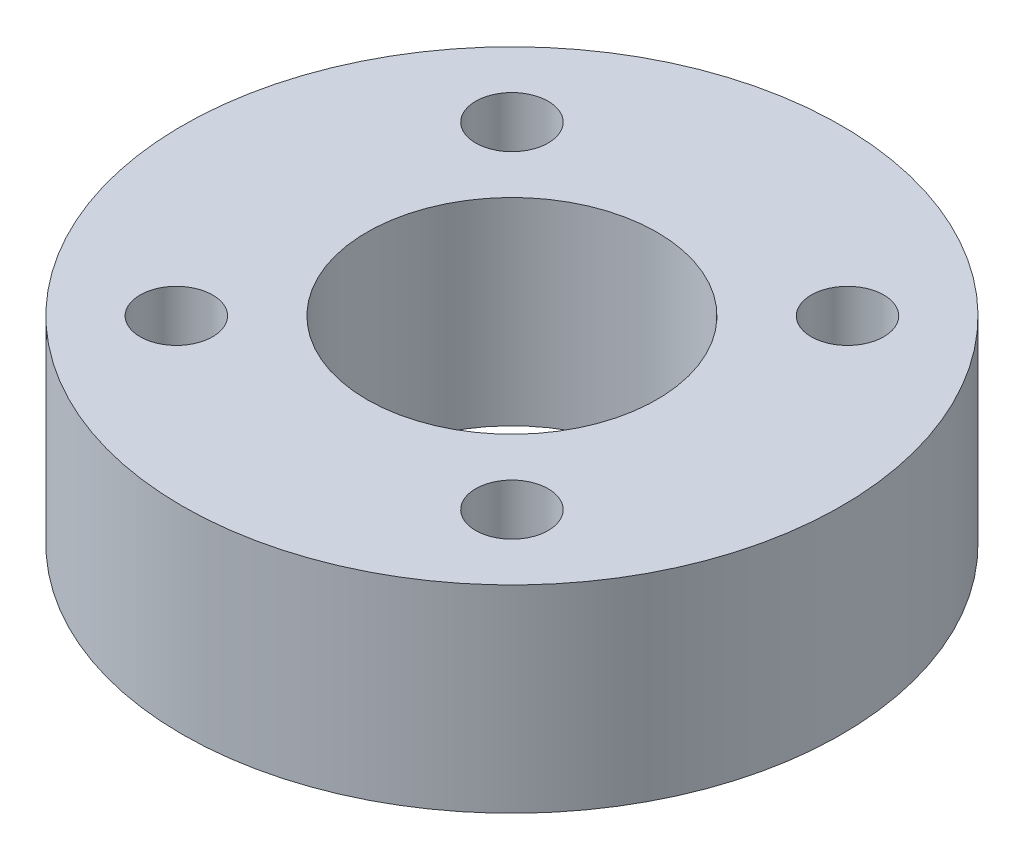
ISO-10303-21;
HEADER;
FILE_DESCRIPTION(('STEP AP214'),'2;1');
FILE_NAME('part.step','',(''),(''),'','','');
FILE_SCHEMA(('AUTOMOTIVE_DESIGN { 1 0 10303 214 1 1 1 1 }'));
ENDSEC;
DATA;
#1=APPLICATION_CONTEXT('core data for automotive mechanical design processes');
#2=APPLICATION_PROTOCOL_DEFINITION('international standard','automotive_design',2000,#1);
#3=PRODUCT_CONTEXT('',#1,'mechanical');
#4=PRODUCT('Part','Part','',(#3));
#5=PRODUCT_RELATED_PRODUCT_CATEGORY('part','',(#4));
#6=PRODUCT_DEFINITION_FORMATION('','',#4);
#7=PRODUCT_DEFINITION_CONTEXT('part definition',#1,'design');
#8=PRODUCT_DEFINITION('design','',#6,#7);
#9=PRODUCT_DEFINITION_SHAPE('','',#8);
#10=(LENGTH_UNIT() NAMED_UNIT(*) SI_UNIT(.MILLI.,.METRE.));
#11=(NAMED_UNIT(*) PLANE_ANGLE_UNIT() SI_UNIT($,.RADIAN.));
#12=(NAMED_UNIT(*) SI_UNIT($,.STERADIAN.) SOLID_ANGLE_UNIT());
#13=UNCERTAINTY_MEASURE_WITH_UNIT(LENGTH_MEASURE(1.E-05),#10,'distance_accuracy_value','');
#14=(GEOMETRIC_REPRESENTATION_CONTEXT(3) GLOBAL_UNCERTAINTY_ASSIGNED_CONTEXT((#13)) GLOBAL_UNIT_ASSIGNED_CONTEXT((#10,
#11,#12)) REPRESENTATION_CONTEXT('',''));
#15=CARTESIAN_POINT('',(0.,0.,0.));
#16=DIRECTION('',(0.,0.,1.));
#17=DIRECTION('',(1.,0.,0.));
#18=AXIS2_PLACEMENT_3D('',#15,#16,#17);
#19=CARTESIAN_POINT('',(0.,15.,0.));
#20=DIRECTION('',(0.,-1.,0.));
#21=DIRECTION('',(0.,0.,-1.));
#22=AXIS2_PLACEMENT_3D('',#19,#20,#21);
#23=CYLINDRICAL_SURFACE('',#22,25.);
#24=CARTESIAN_POINT('',(0.,15.,0.));
#25=DIRECTION('',(0.,1.,0.));
#26=DIRECTION('',(0.,0.,1.));
#27=AXIS2_PLACEMENT_3D('',#24,#25,#26);
#28=CIRCLE('',#27,25.);
#29=CARTESIAN_POINT('',(0.,15.,25.));
#30=VERTEX_POINT('',#29);
#31=EDGE_CURVE('E10',#30,#30,#28,.T.);
#32=ORIENTED_EDGE('',*,*,#31,.F.);
#33=EDGE_LOOP('',(#32));
#34=FACE_BOUND('',#33,.T.);
#35=CARTESIAN_POINT('',(0.,0.,0.));
#36=DIRECTION('',(0.,1.,0.));
#37=DIRECTION('',(0.,0.,1.));
#38=AXIS2_PLACEMENT_3D('',#35,#36,#37);
#39=CIRCLE('',#38,25.);
#40=CARTESIAN_POINT('',(0.,0.,25.));
#41=VERTEX_POINT('',#40);
#42=EDGE_CURVE('E40',#41,#41,#39,.T.);
#43=ORIENTED_EDGE('',*,*,#42,.T.);
#44=EDGE_LOOP('',(#43));
#45=FACE_BOUND('',#44,.T.);
#46=ADVANCED_FACE('F37',(#34,#45),#23,.T.);
#47=CARTESIAN_POINT('',(0.,15.,0.));
#48=DIRECTION('',(0.,1.,0.));
#49=DIRECTION('',(0.,0.,1.));
#50=AXIS2_PLACEMENT_3D('',#47,#48,#49);
#51=PLANE('',#50);
#52=CARTESIAN_POINT('',(-12.7279220613579,15.,-12.7279220613579));
#53=DIRECTION('',(0.,1.,0.));
#54=DIRECTION('',(0.,0.,1.));
#55=AXIS2_PLACEMENT_3D('',#52,#53,#54);
#56=CIRCLE('',#55,2.75);
#57=CARTESIAN_POINT('',(-12.7279220613579,15.,-9.97792206135786));
#58=VERTEX_POINT('',#57);
#59=EDGE_CURVE('E75',#58,#58,#56,.T.);
#60=ORIENTED_EDGE('',*,*,#59,.F.);
#61=EDGE_LOOP('',(#60));
#62=FACE_BOUND('',#61,.T.);
#63=CARTESIAN_POINT('',(12.7279220613579,15.,12.7279220613579));
#64=DIRECTION('',(0.,1.,0.));
#65=DIRECTION('',(0.,0.,1.));
#66=AXIS2_PLACEMENT_3D('',#63,#64,#65);
#67=CIRCLE('',#66,2.75);
#68=CARTESIAN_POINT('',(12.7279220613579,15.,15.4779220613579));
#69=VERTEX_POINT('',#68);
#70=EDGE_CURVE('E69',#69,#69,#67,.T.);
#71=ORIENTED_EDGE('',*,*,#70,.F.);
#72=EDGE_LOOP('',(#71));
#73=FACE_BOUND('',#72,.T.);
#74=CARTESIAN_POINT('',(-12.7279220613579,15.,12.7279220613579));
#75=DIRECTION('',(0.,1.,0.));
#76=DIRECTION('',(0.,0.,1.));
#77=AXIS2_PLACEMENT_3D('',#74,#75,#76);
#78=CIRCLE('',#77,2.75);
#79=CARTESIAN_POINT('',(-12.7279220613579,15.,15.4779220613579));
#80=VERTEX_POINT('',#79);
#81=EDGE_CURVE('E63',#80,#80,#78,.T.);
#82=ORIENTED_EDGE('',*,*,#81,.F.);
#83=EDGE_LOOP('',(#82));
#84=FACE_BOUND('',#83,.T.);
#85=CARTESIAN_POINT('',(12.7279220613579,15.,-12.7279220613579));
#86=DIRECTION('',(0.,1.,0.));
#87=DIRECTION('',(0.,0.,1.));
#88=AXIS2_PLACEMENT_3D('',#85,#86,#87);
#89=CIRCLE('',#88,2.75);
#90=CARTESIAN_POINT('',(12.7279220613579,15.,-9.97792206135786));
#91=VERTEX_POINT('',#90);
#92=EDGE_CURVE('E57',#91,#91,#89,.T.);
#93=ORIENTED_EDGE('',*,*,#92,.F.);
#94=EDGE_LOOP('',(#93));
#95=FACE_BOUND('',#94,.T.);
#96=CARTESIAN_POINT('',(0.,15.,0.));
#97=DIRECTION('',(0.,1.,0.));
#98=DIRECTION('',(0.,0.,1.));
#99=AXIS2_PLACEMENT_3D('',#96,#97,#98);
#100=CIRCLE('',#99,11.);
#101=CARTESIAN_POINT('',(0.,15.,11.));
#102=VERTEX_POINT('',#101);
#103=EDGE_CURVE('E49',#102,#102,#100,.T.);
#104=ORIENTED_EDGE('',*,*,#103,.F.);
#105=EDGE_LOOP('',(#104));
#106=FACE_BOUND('',#105,.T.);
#107=ORIENTED_EDGE('',*,*,#31,.T.);
#108=EDGE_LOOP('',(#107));
#109=FACE_BOUND('',#108,.T.);
#110=ADVANCED_FACE('F81',(#62,#73,#84,#95,#106,#109),#51,.T.);
#111=CARTESIAN_POINT('',(0.,0.,0.));
#112=DIRECTION('',(0.,1.,0.));
#113=DIRECTION('',(0.,0.,1.));
#114=AXIS2_PLACEMENT_3D('',#111,#112,#113);
#115=PLANE('',#114);
#116=CARTESIAN_POINT('',(-12.7279220613579,0.,-12.7279220613579));
#117=DIRECTION('',(0.,1.,0.));
#118=DIRECTION('',(0.,0.,1.));
#119=AXIS2_PLACEMENT_3D('',#116,#117,#118);
#120=CIRCLE('',#119,2.75);
#121=CARTESIAN_POINT('',(-12.7279220613579,0.,-9.97792206135786));
#122=VERTEX_POINT('',#121);
#123=EDGE_CURVE('E72',#122,#122,#120,.T.);
#124=ORIENTED_EDGE('',*,*,#123,.T.);
#125=EDGE_LOOP('',(#124));
#126=FACE_BOUND('',#125,.T.);
#127=CARTESIAN_POINT('',(12.7279220613579,0.,12.7279220613579));
#128=DIRECTION('',(0.,1.,0.));
#129=DIRECTION('',(0.,0.,1.));
#130=AXIS2_PLACEMENT_3D('',#127,#128,#129);
#131=CIRCLE('',#130,2.75);
#132=CARTESIAN_POINT('',(12.7279220613579,0.,15.4779220613578));
#133=VERTEX_POINT('',#132);
#134=EDGE_CURVE('E66',#133,#133,#131,.T.);
#135=ORIENTED_EDGE('',*,*,#134,.T.);
#136=EDGE_LOOP('',(#135));
#137=FACE_BOUND('',#136,.T.);
#138=CARTESIAN_POINT('',(-12.7279220613579,0.,12.7279220613579));
#139=DIRECTION('',(0.,1.,0.));
#140=DIRECTION('',(0.,0.,1.));
#141=AXIS2_PLACEMENT_3D('',#138,#139,#140);
#142=CIRCLE('',#141,2.75);
#143=CARTESIAN_POINT('',(-12.7279220613579,0.,15.4779220613578));
#144=VERTEX_POINT('',#143);
#145=EDGE_CURVE('E60',#144,#144,#142,.T.);
#146=ORIENTED_EDGE('',*,*,#145,.T.);
#147=EDGE_LOOP('',(#146));
#148=FACE_BOUND('',#147,.T.);
#149=CARTESIAN_POINT('',(12.7279220613579,0.,-12.7279220613579));
#150=DIRECTION('',(0.,1.,0.));
#151=DIRECTION('',(0.,0.,1.));
#152=AXIS2_PLACEMENT_3D('',#149,#150,#151);
#153=CIRCLE('',#152,2.75);
#154=CARTESIAN_POINT('',(12.7279220613579,0.,-9.97792206135786));
#155=VERTEX_POINT('',#154);
#156=EDGE_CURVE('E52',#155,#155,#153,.T.);
#157=ORIENTED_EDGE('',*,*,#156,.T.);
#158=EDGE_LOOP('',(#157));
#159=FACE_BOUND('',#158,.T.);
#160=CARTESIAN_POINT('',(0.,0.,0.));
#161=DIRECTION('',(0.,1.,0.));
#162=DIRECTION('',(0.,0.,1.));
#163=AXIS2_PLACEMENT_3D('',#160,#161,#162);
#164=CIRCLE('',#163,11.);
#165=CARTESIAN_POINT('',(0.,0.,11.));
#166=VERTEX_POINT('',#165);
#167=EDGE_CURVE('E47',#166,#166,#164,.T.);
#168=ORIENTED_EDGE('',*,*,#167,.T.);
#169=EDGE_LOOP('',(#168));
#170=FACE_BOUND('',#169,.T.);
#171=ORIENTED_EDGE('',*,*,#42,.F.);
#172=EDGE_LOOP('',(#171));
#173=FACE_BOUND('',#172,.T.);
#174=ADVANCED_FACE('F84',(#126,#137,#148,#159,#170,#173),#115,.F.);
#175=CARTESIAN_POINT('',(0.,0.,0.));
#176=DIRECTION('',(0.,1.,0.));
#177=DIRECTION('',(0.,0.,1.));
#178=AXIS2_PLACEMENT_3D('',#175,#176,#177);
#179=CYLINDRICAL_SURFACE('',#178,11.);
#180=ORIENTED_EDGE('',*,*,#167,.F.);
#181=EDGE_LOOP('',(#180));
#182=FACE_BOUND('',#181,.T.);
#183=ORIENTED_EDGE('',*,*,#103,.T.);
#184=EDGE_LOOP('',(#183));
#185=FACE_BOUND('',#184,.T.);
#186=ADVANCED_FACE('F94',(#182,#185),#179,.F.);
#187=CARTESIAN_POINT('',(12.7279220613579,15.,-12.7279220613579));
#188=DIRECTION('',(0.,1.,0.));
#189=DIRECTION('',(0.,0.,1.));
#190=AXIS2_PLACEMENT_3D('',#187,#188,#189);
#191=CYLINDRICAL_SURFACE('',#190,2.75);
#192=ORIENTED_EDGE('',*,*,#156,.F.);
#193=EDGE_LOOP('',(#192));
#194=FACE_BOUND('',#193,.T.);
#195=ORIENTED_EDGE('',*,*,#92,.T.);
#196=EDGE_LOOP('',(#195));
#197=FACE_BOUND('',#196,.T.);
#198=ADVANCED_FACE('F96',(#194,#197),#191,.F.);
#199=CARTESIAN_POINT('',(-12.7279220613579,15.,12.7279220613579));
#200=DIRECTION('',(0.,1.,0.));
#201=DIRECTION('',(0.,0.,1.));
#202=AXIS2_PLACEMENT_3D('',#199,#200,#201);
#203=CYLINDRICAL_SURFACE('',#202,2.75);
#204=ORIENTED_EDGE('',*,*,#145,.F.);
#205=EDGE_LOOP('',(#204));
#206=FACE_BOUND('',#205,.T.);
#207=ORIENTED_EDGE('',*,*,#81,.T.);
#208=EDGE_LOOP('',(#207));
#209=FACE_BOUND('',#208,.T.);
#210=ADVANCED_FACE('F103',(#206,#209),#203,.F.);
#211=CARTESIAN_POINT('',(12.7279220613579,15.,12.7279220613579));
#212=DIRECTION('',(0.,1.,0.));
#213=DIRECTION('',(0.,0.,1.));
#214=AXIS2_PLACEMENT_3D('',#211,#212,#213);
#215=CYLINDRICAL_SURFACE('',#214,2.75);
#216=ORIENTED_EDGE('',*,*,#134,.F.);
#217=EDGE_LOOP('',(#216));
#218=FACE_BOUND('',#217,.T.);
#219=ORIENTED_EDGE('',*,*,#70,.T.);
#220=EDGE_LOOP('',(#219));
#221=FACE_BOUND('',#220,.T.);
#222=ADVANCED_FACE('F147',(#218,#221),#215,.F.);
#223=CARTESIAN_POINT('',(-12.7279220613579,15.,-12.7279220613579));
#224=DIRECTION('',(0.,1.,0.));
#225=DIRECTION('',(0.,0.,1.));
#226=AXIS2_PLACEMENT_3D('',#223,#224,#225);
#227=CYLINDRICAL_SURFACE('',#226,2.75);
#228=ORIENTED_EDGE('',*,*,#123,.F.);
#229=EDGE_LOOP('',(#228));
#230=FACE_BOUND('',#229,.T.);
#231=ORIENTED_EDGE('',*,*,#59,.T.);
#232=EDGE_LOOP('',(#231));
#233=FACE_BOUND('',#232,.T.);
#234=ADVANCED_FACE('F79',(#230,#233),#227,.F.);
#235=CLOSED_SHELL('',(#46,#110,#174,#186,#198,#210,#222,#234));
#236=MANIFOLD_SOLID_BREP('B2',#235);
#237=ADVANCED_BREP_SHAPE_REPRESENTATION('',(#18,#236),#14);
#238=SHAPE_DEFINITION_REPRESENTATION(#9,#237);
ENDSEC;
END-ISO-10303-21;
